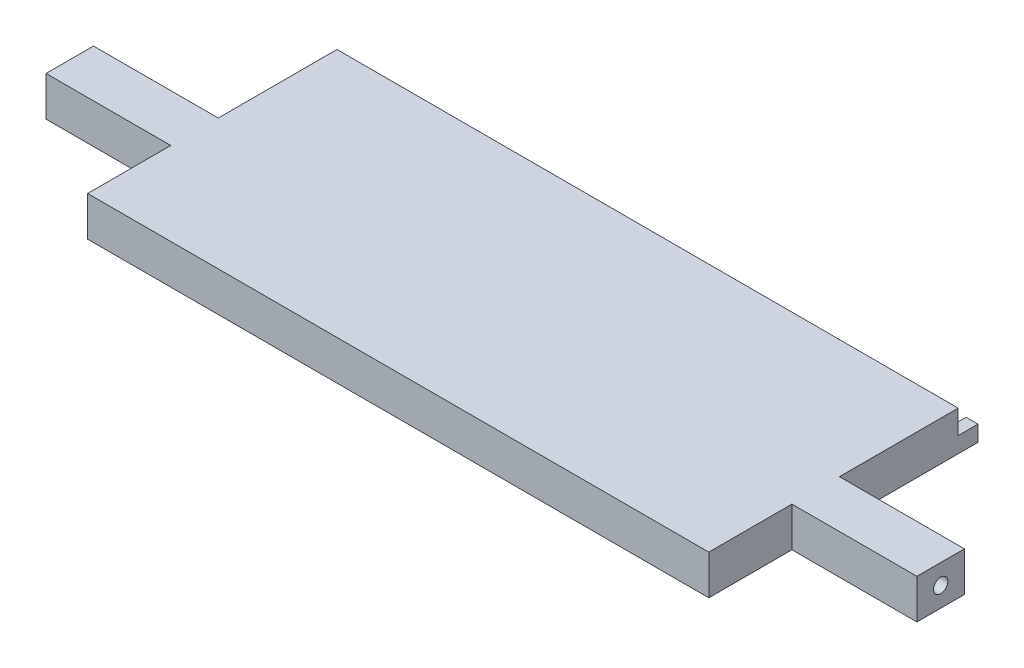
ISO-10303-21;
HEADER;
FILE_DESCRIPTION(('STEP AP214'),'2;1');
FILE_NAME('part.step','',(''),(''),'','','');
FILE_SCHEMA(('AUTOMOTIVE_DESIGN { 1 0 10303 214 1 1 1 1 }'));
ENDSEC;
DATA;
#1=APPLICATION_CONTEXT('core data for automotive mechanical design processes');
#2=APPLICATION_PROTOCOL_DEFINITION('international standard','automotive_design',2000,#1);
#3=PRODUCT_CONTEXT('',#1,'mechanical');
#4=PRODUCT('Part','Part','',(#3));
#5=PRODUCT_RELATED_PRODUCT_CATEGORY('part','',(#4));
#6=PRODUCT_DEFINITION_FORMATION('','',#4);
#7=PRODUCT_DEFINITION_CONTEXT('part definition',#1,'design');
#8=PRODUCT_DEFINITION('design','',#6,#7);
#9=PRODUCT_DEFINITION_SHAPE('','',#8);
#10=(LENGTH_UNIT() NAMED_UNIT(*) SI_UNIT(.MILLI.,.METRE.));
#11=(NAMED_UNIT(*) PLANE_ANGLE_UNIT() SI_UNIT($,.RADIAN.));
#12=(NAMED_UNIT(*) SI_UNIT($,.STERADIAN.) SOLID_ANGLE_UNIT());
#13=UNCERTAINTY_MEASURE_WITH_UNIT(LENGTH_MEASURE(1.E-05),#10,'distance_accuracy_value','');
#14=(GEOMETRIC_REPRESENTATION_CONTEXT(3) GLOBAL_UNCERTAINTY_ASSIGNED_CONTEXT((#13)) GLOBAL_UNIT_ASSIGNED_CONTEXT((#10,
#11,#12)) REPRESENTATION_CONTEXT('',''));
#15=CARTESIAN_POINT('',(0.,0.,0.));
#16=DIRECTION('',(0.,0.,1.));
#17=DIRECTION('',(1.,0.,0.));
#18=AXIS2_PLACEMENT_3D('',#15,#16,#17);
#19=CARTESIAN_POINT('',(0.,0.,0.));
#20=DIRECTION('',(0.,0.,-1.));
#21=DIRECTION('',(-1.,0.,0.));
#22=AXIS2_PLACEMENT_3D('',#19,#20,#21);
#23=PLANE('',#22);
#24=DIRECTION('',(0.,1.,0.));
#25=VECTOR('',#24,1.);
#26=CARTESIAN_POINT('',(188.428323293158,0.,0.));
#27=LINE('',#26,#25);
#28=CARTESIAN_POINT('',(188.428323293158,0.,0.));
#29=VERTEX_POINT('',#28);
#30=CARTESIAN_POINT('',(188.428323293158,4.,0.));
#31=VERTEX_POINT('',#30);
#32=EDGE_CURVE('E318',#29,#31,#27,.T.);
#33=ORIENTED_EDGE('',*,*,#32,.F.);
#34=DIRECTION('',(1.,0.,0.));
#35=VECTOR('',#34,1.);
#36=CARTESIAN_POINT('',(0.,0.,0.));
#37=LINE('',#36,#35);
#38=CARTESIAN_POINT('',(31.5116767068419,0.,0.));
#39=VERTEX_POINT('',#38);
#40=EDGE_CURVE('E476',#39,#29,#37,.T.);
#41=ORIENTED_EDGE('',*,*,#40,.F.);
#42=DIRECTION('',(0.,1.,0.));
#43=VECTOR('',#42,1.);
#44=CARTESIAN_POINT('',(31.5116767068419,0.,0.));
#45=LINE('',#44,#43);
#46=CARTESIAN_POINT('',(31.5116767068419,4.,0.));
#47=VERTEX_POINT('',#46);
#48=EDGE_CURVE('E338',#39,#47,#45,.T.);
#49=ORIENTED_EDGE('',*,*,#48,.T.);
#50=DIRECTION('',(-1.,0.,0.));
#51=VECTOR('',#50,1.);
#52=CARTESIAN_POINT('',(0.,4.,0.));
#53=LINE('',#52,#51);
#54=CARTESIAN_POINT('',(34.5116767068419,4.,0.));
#55=VERTEX_POINT('',#54);
#56=EDGE_CURVE('E351',#55,#47,#53,.T.);
#57=ORIENTED_EDGE('',*,*,#56,.F.);
#58=CARTESIAN_POINT('',(37.97,5.,0.));
#59=DIRECTION('',(0.,0.,1.));
#60=DIRECTION('',(1.,0.,0.));
#61=AXIS2_PLACEMENT_3D('',#58,#59,#60);
#62=CIRCLE('',#61,3.6);
#63=CARTESIAN_POINT('',(41.4283232931581,4.,0.));
#64=VERTEX_POINT('',#63);
#65=EDGE_CURVE('E471',#55,#64,#62,.T.);
#66=ORIENTED_EDGE('',*,*,#65,.T.);
#67=CARTESIAN_POINT('',(52.5116767068419,4.,0.));
#68=VERTEX_POINT('',#67);
#69=EDGE_CURVE('E512',#68,#64,#53,.T.);
#70=ORIENTED_EDGE('',*,*,#69,.F.);
#71=CARTESIAN_POINT('',(55.97,5.,0.));
#72=DIRECTION('',(0.,0.,1.));
#73=DIRECTION('',(1.,0.,0.));
#74=AXIS2_PLACEMENT_3D('',#71,#72,#73);
#75=CIRCLE('',#74,3.6);
#76=CARTESIAN_POINT('',(59.4283232931581,4.,0.));
#77=VERTEX_POINT('',#76);
#78=EDGE_CURVE('E466',#68,#77,#75,.T.);
#79=ORIENTED_EDGE('',*,*,#78,.T.);
#80=CARTESIAN_POINT('',(70.5116767068419,4.,0.));
#81=VERTEX_POINT('',#80);
#82=EDGE_CURVE('E513',#81,#77,#53,.T.);
#83=ORIENTED_EDGE('',*,*,#82,.F.);
#84=CARTESIAN_POINT('',(73.97,5.,0.));
#85=DIRECTION('',(0.,0.,1.));
#86=DIRECTION('',(1.,0.,0.));
#87=AXIS2_PLACEMENT_3D('',#84,#85,#86);
#88=CIRCLE('',#87,3.6);
#89=CARTESIAN_POINT('',(77.4283232931581,4.,0.));
#90=VERTEX_POINT('',#89);
#91=EDGE_CURVE('E460',#81,#90,#88,.T.);
#92=ORIENTED_EDGE('',*,*,#91,.T.);
#93=CARTESIAN_POINT('',(88.5116767068419,4.,0.));
#94=VERTEX_POINT('',#93);
#95=EDGE_CURVE('E516',#94,#90,#53,.T.);
#96=ORIENTED_EDGE('',*,*,#95,.F.);
#97=CARTESIAN_POINT('',(91.97,5.,0.));
#98=DIRECTION('',(0.,0.,1.));
#99=DIRECTION('',(1.,0.,0.));
#100=AXIS2_PLACEMENT_3D('',#97,#98,#99);
#101=CIRCLE('',#100,3.6);
#102=CARTESIAN_POINT('',(95.4283232931581,4.,0.));
#103=VERTEX_POINT('',#102);
#104=EDGE_CURVE('E454',#94,#103,#101,.T.);
#105=ORIENTED_EDGE('',*,*,#104,.T.);
#106=CARTESIAN_POINT('',(106.511676706842,4.,0.));
#107=VERTEX_POINT('',#106);
#108=EDGE_CURVE('E519',#107,#103,#53,.T.);
#109=ORIENTED_EDGE('',*,*,#108,.F.);
#110=CARTESIAN_POINT('',(109.97,5.,0.));
#111=DIRECTION('',(0.,0.,1.));
#112=DIRECTION('',(1.,0.,0.));
#113=AXIS2_PLACEMENT_3D('',#110,#111,#112);
#114=CIRCLE('',#113,3.6);
#115=CARTESIAN_POINT('',(113.428323293158,4.,0.));
#116=VERTEX_POINT('',#115);
#117=EDGE_CURVE('E448',#107,#116,#114,.T.);
#118=ORIENTED_EDGE('',*,*,#117,.T.);
#119=CARTESIAN_POINT('',(124.511676706842,4.,0.));
#120=VERTEX_POINT('',#119);
#121=EDGE_CURVE('E522',#120,#116,#53,.T.);
#122=ORIENTED_EDGE('',*,*,#121,.F.);
#123=CARTESIAN_POINT('',(127.97,5.,0.));
#124=DIRECTION('',(0.,0.,1.));
#125=DIRECTION('',(1.,0.,0.));
#126=AXIS2_PLACEMENT_3D('',#123,#124,#125);
#127=CIRCLE('',#126,3.59999999999999);
#128=CARTESIAN_POINT('',(131.428323293158,4.,0.));
#129=VERTEX_POINT('',#128);
#130=EDGE_CURVE('E442',#120,#129,#127,.T.);
#131=ORIENTED_EDGE('',*,*,#130,.T.);
#132=CARTESIAN_POINT('',(142.511676706842,4.,0.));
#133=VERTEX_POINT('',#132);
#134=EDGE_CURVE('E525',#133,#129,#53,.T.);
#135=ORIENTED_EDGE('',*,*,#134,.F.);
#136=CARTESIAN_POINT('',(145.97,5.,0.));
#137=DIRECTION('',(0.,0.,1.));
#138=DIRECTION('',(1.,0.,0.));
#139=AXIS2_PLACEMENT_3D('',#136,#137,#138);
#140=CIRCLE('',#139,3.59999999999999);
#141=CARTESIAN_POINT('',(149.428323293158,4.,0.));
#142=VERTEX_POINT('',#141);
#143=EDGE_CURVE('E436',#133,#142,#140,.T.);
#144=ORIENTED_EDGE('',*,*,#143,.T.);
#145=CARTESIAN_POINT('',(160.511676706842,4.,0.));
#146=VERTEX_POINT('',#145);
#147=EDGE_CURVE('E528',#146,#142,#53,.T.);
#148=ORIENTED_EDGE('',*,*,#147,.F.);
#149=CARTESIAN_POINT('',(163.97,5.,0.));
#150=DIRECTION('',(0.,0.,1.));
#151=DIRECTION('',(1.,0.,0.));
#152=AXIS2_PLACEMENT_3D('',#149,#150,#151);
#153=CIRCLE('',#152,3.59999999999999);
#154=CARTESIAN_POINT('',(167.428323293158,4.,0.));
#155=VERTEX_POINT('',#154);
#156=EDGE_CURVE('E430',#146,#155,#153,.T.);
#157=ORIENTED_EDGE('',*,*,#156,.T.);
#158=CARTESIAN_POINT('',(178.511676706842,4.,0.));
#159=VERTEX_POINT('',#158);
#160=EDGE_CURVE('E357',#159,#155,#53,.T.);
#161=ORIENTED_EDGE('',*,*,#160,.F.);
#162=CARTESIAN_POINT('',(181.97,5.,0.));
#163=DIRECTION('',(0.,0.,1.));
#164=DIRECTION('',(1.,0.,0.));
#165=AXIS2_PLACEMENT_3D('',#162,#163,#164);
#166=CIRCLE('',#165,3.59999999999999);
#167=CARTESIAN_POINT('',(185.428323293158,4.,0.));
#168=VERTEX_POINT('',#167);
#169=EDGE_CURVE('E424',#159,#168,#166,.T.);
#170=ORIENTED_EDGE('',*,*,#169,.T.);
#171=EDGE_CURVE('E354',#31,#168,#53,.T.);
#172=ORIENTED_EDGE('',*,*,#171,.F.);
#173=EDGE_LOOP('',(#33,#41,#49,#57,#66,#70,#79,#83,#92,#96,#105,#109,#118,#122,#131,#135,#144,
#148,#157,#161,#170,#172));
#174=FACE_BOUND('',#173,.T.);
#175=ADVANCED_FACE('F35',(#174),#23,.T.);
#176=CARTESIAN_POINT('',(37.97,5.,65.));
#177=DIRECTION('',(0.,0.,-1.));
#178=DIRECTION('',(-1.,0.,0.));
#179=AXIS2_PLACEMENT_3D('',#176,#177,#178);
#180=CYLINDRICAL_SURFACE('',#179,3.6);
#181=CARTESIAN_POINT('',(37.97,5.,65.));
#182=DIRECTION('',(0.,0.,1.));
#183=DIRECTION('',(1.,0.,0.));
#184=AXIS2_PLACEMENT_3D('',#181,#182,#183);
#185=CIRCLE('',#184,3.6);
#186=CARTESIAN_POINT('',(41.57,5.,65.));
#187=VERTEX_POINT('',#186);
#188=EDGE_CURVE('E284',#187,#187,#185,.T.);
#189=ORIENTED_EDGE('',*,*,#188,.T.);
#190=EDGE_LOOP('',(#189));
#191=FACE_BOUND('',#190,.T.);
#192=CARTESIAN_POINT('',(37.97,5.,5.));
#193=DIRECTION('',(0.,0.,1.));
#194=DIRECTION('',(1.,0.,0.));
#195=AXIS2_PLACEMENT_3D('',#192,#193,#194);
#196=CIRCLE('',#195,3.6);
#197=CARTESIAN_POINT('',(41.4283232931581,4.,5.));
#198=VERTEX_POINT('',#197);
#199=CARTESIAN_POINT('',(34.5116767068419,4.,5.));
#200=VERTEX_POINT('',#199);
#201=EDGE_CURVE('E421',#198,#200,#196,.T.);
#202=ORIENTED_EDGE('',*,*,#201,.F.);
#203=DIRECTION('',(0.,0.,-1.));
#204=VECTOR('',#203,1.);
#205=CARTESIAN_POINT('',(41.4283232931581,4.,65.));
#206=LINE('',#205,#204);
#207=EDGE_CURVE('E404',#198,#64,#206,.T.);
#208=ORIENTED_EDGE('',*,*,#207,.T.);
#209=ORIENTED_EDGE('',*,*,#65,.F.);
#210=DIRECTION('',(0.,0.,-1.));
#211=VECTOR('',#210,1.);
#212=CARTESIAN_POINT('',(34.5116767068419,4.,65.));
#213=LINE('',#212,#211);
#214=EDGE_CURVE('E401',#55,#200,#213,.F.);
#215=ORIENTED_EDGE('',*,*,#214,.T.);
#216=EDGE_LOOP('',(#202,#208,#209,#215));
#217=FACE_BOUND('',#216,.T.);
#218=ADVANCED_FACE('F580',(#191,#217),#180,.F.);
#219=CARTESIAN_POINT('',(55.97,5.,65.));
#220=DIRECTION('',(0.,0.,-1.));
#221=DIRECTION('',(-1.,0.,0.));
#222=AXIS2_PLACEMENT_3D('',#219,#220,#221);
#223=CYLINDRICAL_SURFACE('',#222,3.6);
#224=CARTESIAN_POINT('',(55.97,5.,65.));
#225=DIRECTION('',(0.,0.,1.));
#226=DIRECTION('',(1.,0.,0.));
#227=AXIS2_PLACEMENT_3D('',#224,#225,#226);
#228=CIRCLE('',#227,3.6);
#229=CARTESIAN_POINT('',(59.57,5.,65.));
#230=VERTEX_POINT('',#229);
#231=EDGE_CURVE('E463',#230,#230,#228,.T.);
#232=ORIENTED_EDGE('',*,*,#231,.T.);
#233=EDGE_LOOP('',(#232));
#234=FACE_BOUND('',#233,.T.);
#235=CARTESIAN_POINT('',(55.97,5.,5.));
#236=DIRECTION('',(0.,0.,1.));
#237=DIRECTION('',(1.,0.,0.));
#238=AXIS2_PLACEMENT_3D('',#235,#236,#237);
#239=CIRCLE('',#238,3.6);
#240=CARTESIAN_POINT('',(59.4283232931581,4.,5.));
#241=VERTEX_POINT('',#240);
#242=CARTESIAN_POINT('',(52.5116767068419,4.,5.));
#243=VERTEX_POINT('',#242);
#244=EDGE_CURVE('E419',#241,#243,#239,.T.);
#245=ORIENTED_EDGE('',*,*,#244,.F.);
#246=DIRECTION('',(0.,0.,-1.));
#247=VECTOR('',#246,1.);
#248=CARTESIAN_POINT('',(59.4283232931581,4.,65.));
#249=LINE('',#248,#247);
#250=EDGE_CURVE('E398',#241,#77,#249,.T.);
#251=ORIENTED_EDGE('',*,*,#250,.T.);
#252=ORIENTED_EDGE('',*,*,#78,.F.);
#253=DIRECTION('',(0.,0.,-1.));
#254=VECTOR('',#253,1.);
#255=CARTESIAN_POINT('',(52.5116767068419,4.,65.));
#256=LINE('',#255,#254);
#257=EDGE_CURVE('E395',#68,#243,#256,.F.);
#258=ORIENTED_EDGE('',*,*,#257,.T.);
#259=EDGE_LOOP('',(#245,#251,#252,#258));
#260=FACE_BOUND('',#259,.T.);
#261=ADVANCED_FACE('F584',(#234,#260),#223,.F.);
#262=CARTESIAN_POINT('',(73.97,5.,65.));
#263=DIRECTION('',(0.,0.,-1.));
#264=DIRECTION('',(-1.,0.,0.));
#265=AXIS2_PLACEMENT_3D('',#262,#263,#264);
#266=CYLINDRICAL_SURFACE('',#265,3.6);
#267=CARTESIAN_POINT('',(73.97,5.,65.));
#268=DIRECTION('',(0.,0.,1.));
#269=DIRECTION('',(1.,0.,0.));
#270=AXIS2_PLACEMENT_3D('',#267,#268,#269);
#271=CIRCLE('',#270,3.6);
#272=CARTESIAN_POINT('',(77.57,5.,65.));
#273=VERTEX_POINT('',#272);
#274=EDGE_CURVE('E457',#273,#273,#271,.T.);
#275=ORIENTED_EDGE('',*,*,#274,.T.);
#276=EDGE_LOOP('',(#275));
#277=FACE_BOUND('',#276,.T.);
#278=CARTESIAN_POINT('',(73.97,5.,5.));
#279=DIRECTION('',(0.,0.,1.));
#280=DIRECTION('',(1.,0.,0.));
#281=AXIS2_PLACEMENT_3D('',#278,#279,#280);
#282=CIRCLE('',#281,3.6);
#283=CARTESIAN_POINT('',(77.4283232931581,4.,5.));
#284=VERTEX_POINT('',#283);
#285=CARTESIAN_POINT('',(70.5116767068419,4.,5.));
#286=VERTEX_POINT('',#285);
#287=EDGE_CURVE('E417',#284,#286,#282,.T.);
#288=ORIENTED_EDGE('',*,*,#287,.F.);
#289=DIRECTION('',(0.,0.,-1.));
#290=VECTOR('',#289,1.);
#291=CARTESIAN_POINT('',(77.4283232931581,4.,65.));
#292=LINE('',#291,#290);
#293=EDGE_CURVE('E392',#284,#90,#292,.T.);
#294=ORIENTED_EDGE('',*,*,#293,.T.);
#295=ORIENTED_EDGE('',*,*,#91,.F.);
#296=DIRECTION('',(0.,0.,-1.));
#297=VECTOR('',#296,1.);
#298=CARTESIAN_POINT('',(70.5116767068419,4.,65.));
#299=LINE('',#298,#297);
#300=EDGE_CURVE('E389',#81,#286,#299,.F.);
#301=ORIENTED_EDGE('',*,*,#300,.T.);
#302=EDGE_LOOP('',(#288,#294,#295,#301));
#303=FACE_BOUND('',#302,.T.);
#304=ADVANCED_FACE('F614',(#277,#303),#266,.F.);
#305=CARTESIAN_POINT('',(91.97,5.,65.));
#306=DIRECTION('',(0.,0.,-1.));
#307=DIRECTION('',(-1.,0.,0.));
#308=AXIS2_PLACEMENT_3D('',#305,#306,#307);
#309=CYLINDRICAL_SURFACE('',#308,3.6);
#310=CARTESIAN_POINT('',(91.97,5.,65.));
#311=DIRECTION('',(0.,0.,1.));
#312=DIRECTION('',(1.,0.,0.));
#313=AXIS2_PLACEMENT_3D('',#310,#311,#312);
#314=CIRCLE('',#313,3.6);
#315=CARTESIAN_POINT('',(95.57,5.,65.));
#316=VERTEX_POINT('',#315);
#317=EDGE_CURVE('E451',#316,#316,#314,.T.);
#318=ORIENTED_EDGE('',*,*,#317,.T.);
#319=EDGE_LOOP('',(#318));
#320=FACE_BOUND('',#319,.T.);
#321=CARTESIAN_POINT('',(91.97,5.,5.));
#322=DIRECTION('',(0.,0.,1.));
#323=DIRECTION('',(1.,0.,0.));
#324=AXIS2_PLACEMENT_3D('',#321,#322,#323);
#325=CIRCLE('',#324,3.6);
#326=CARTESIAN_POINT('',(95.4283232931581,4.,5.));
#327=VERTEX_POINT('',#326);
#328=CARTESIAN_POINT('',(88.5116767068419,4.,5.));
#329=VERTEX_POINT('',#328);
#330=EDGE_CURVE('E415',#327,#329,#325,.T.);
#331=ORIENTED_EDGE('',*,*,#330,.F.);
#332=DIRECTION('',(0.,0.,-1.));
#333=VECTOR('',#332,1.);
#334=CARTESIAN_POINT('',(95.4283232931581,4.,65.));
#335=LINE('',#334,#333);
#336=EDGE_CURVE('E386',#327,#103,#335,.T.);
#337=ORIENTED_EDGE('',*,*,#336,.T.);
#338=ORIENTED_EDGE('',*,*,#104,.F.);
#339=DIRECTION('',(0.,0.,-1.));
#340=VECTOR('',#339,1.);
#341=CARTESIAN_POINT('',(88.5116767068419,4.,65.));
#342=LINE('',#341,#340);
#343=EDGE_CURVE('E383',#94,#329,#342,.F.);
#344=ORIENTED_EDGE('',*,*,#343,.T.);
#345=EDGE_LOOP('',(#331,#337,#338,#344));
#346=FACE_BOUND('',#345,.T.);
#347=ADVANCED_FACE('F609',(#320,#346),#309,.F.);
#348=CARTESIAN_POINT('',(109.97,5.,65.));
#349=DIRECTION('',(0.,0.,-1.));
#350=DIRECTION('',(-1.,0.,0.));
#351=AXIS2_PLACEMENT_3D('',#348,#349,#350);
#352=CYLINDRICAL_SURFACE('',#351,3.6);
#353=CARTESIAN_POINT('',(109.97,5.,65.));
#354=DIRECTION('',(0.,0.,1.));
#355=DIRECTION('',(1.,0.,0.));
#356=AXIS2_PLACEMENT_3D('',#353,#354,#355);
#357=CIRCLE('',#356,3.6);
#358=CARTESIAN_POINT('',(113.57,5.,65.));
#359=VERTEX_POINT('',#358);
#360=EDGE_CURVE('E445',#359,#359,#357,.T.);
#361=ORIENTED_EDGE('',*,*,#360,.T.);
#362=EDGE_LOOP('',(#361));
#363=FACE_BOUND('',#362,.T.);
#364=CARTESIAN_POINT('',(109.97,5.,5.));
#365=DIRECTION('',(0.,0.,1.));
#366=DIRECTION('',(1.,0.,0.));
#367=AXIS2_PLACEMENT_3D('',#364,#365,#366);
#368=CIRCLE('',#367,3.6);
#369=CARTESIAN_POINT('',(113.428323293158,4.,5.));
#370=VERTEX_POINT('',#369);
#371=CARTESIAN_POINT('',(106.511676706842,4.,5.));
#372=VERTEX_POINT('',#371);
#373=EDGE_CURVE('E413',#370,#372,#368,.T.);
#374=ORIENTED_EDGE('',*,*,#373,.F.);
#375=DIRECTION('',(0.,0.,-1.));
#376=VECTOR('',#375,1.);
#377=CARTESIAN_POINT('',(113.428323293158,4.,65.));
#378=LINE('',#377,#376);
#379=EDGE_CURVE('E380',#370,#116,#378,.T.);
#380=ORIENTED_EDGE('',*,*,#379,.T.);
#381=ORIENTED_EDGE('',*,*,#117,.F.);
#382=DIRECTION('',(0.,0.,-1.));
#383=VECTOR('',#382,1.);
#384=CARTESIAN_POINT('',(106.511676706842,4.,65.));
#385=LINE('',#384,#383);
#386=EDGE_CURVE('E377',#107,#372,#385,.F.);
#387=ORIENTED_EDGE('',*,*,#386,.T.);
#388=EDGE_LOOP('',(#374,#380,#381,#387));
#389=FACE_BOUND('',#388,.T.);
#390=ADVANCED_FACE('F606',(#363,#389),#352,.F.);
#391=CARTESIAN_POINT('',(127.97,5.,65.));
#392=DIRECTION('',(0.,0.,-1.));
#393=DIRECTION('',(-1.,0.,0.));
#394=AXIS2_PLACEMENT_3D('',#391,#392,#393);
#395=CYLINDRICAL_SURFACE('',#394,3.59999999999999);
#396=CARTESIAN_POINT('',(127.97,5.,65.));
#397=DIRECTION('',(0.,0.,1.));
#398=DIRECTION('',(1.,0.,0.));
#399=AXIS2_PLACEMENT_3D('',#396,#397,#398);
#400=CIRCLE('',#399,3.59999999999999);
#401=CARTESIAN_POINT('',(131.57,5.,65.));
#402=VERTEX_POINT('',#401);
#403=EDGE_CURVE('E439',#402,#402,#400,.T.);
#404=ORIENTED_EDGE('',*,*,#403,.T.);
#405=EDGE_LOOP('',(#404));
#406=FACE_BOUND('',#405,.T.);
#407=CARTESIAN_POINT('',(127.97,5.,5.));
#408=DIRECTION('',(0.,0.,1.));
#409=DIRECTION('',(1.,0.,0.));
#410=AXIS2_PLACEMENT_3D('',#407,#408,#409);
#411=CIRCLE('',#410,3.59999999999999);
#412=CARTESIAN_POINT('',(131.428323293158,4.,5.));
#413=VERTEX_POINT('',#412);
#414=CARTESIAN_POINT('',(124.511676706842,4.,5.));
#415=VERTEX_POINT('',#414);
#416=EDGE_CURVE('E411',#413,#415,#411,.T.);
#417=ORIENTED_EDGE('',*,*,#416,.F.);
#418=DIRECTION('',(0.,0.,-1.));
#419=VECTOR('',#418,1.);
#420=CARTESIAN_POINT('',(131.428323293158,4.,65.));
#421=LINE('',#420,#419);
#422=EDGE_CURVE('E374',#413,#129,#421,.T.);
#423=ORIENTED_EDGE('',*,*,#422,.T.);
#424=ORIENTED_EDGE('',*,*,#130,.F.);
#425=DIRECTION('',(0.,0.,-1.));
#426=VECTOR('',#425,1.);
#427=CARTESIAN_POINT('',(124.511676706842,4.,65.));
#428=LINE('',#427,#426);
#429=EDGE_CURVE('E371',#120,#415,#428,.F.);
#430=ORIENTED_EDGE('',*,*,#429,.T.);
#431=EDGE_LOOP('',(#417,#423,#424,#430));
#432=FACE_BOUND('',#431,.T.);
#433=ADVANCED_FACE('F603',(#406,#432),#395,.F.);
#434=CARTESIAN_POINT('',(145.97,5.,65.));
#435=DIRECTION('',(0.,0.,-1.));
#436=DIRECTION('',(-1.,0.,0.));
#437=AXIS2_PLACEMENT_3D('',#434,#435,#436);
#438=CYLINDRICAL_SURFACE('',#437,3.59999999999999);
#439=CARTESIAN_POINT('',(145.97,5.,65.));
#440=DIRECTION('',(0.,0.,1.));
#441=DIRECTION('',(1.,0.,0.));
#442=AXIS2_PLACEMENT_3D('',#439,#440,#441);
#443=CIRCLE('',#442,3.59999999999999);
#444=CARTESIAN_POINT('',(149.57,5.,65.));
#445=VERTEX_POINT('',#444);
#446=EDGE_CURVE('E433',#445,#445,#443,.T.);
#447=ORIENTED_EDGE('',*,*,#446,.T.);
#448=EDGE_LOOP('',(#447));
#449=FACE_BOUND('',#448,.T.);
#450=CARTESIAN_POINT('',(145.97,5.,5.));
#451=DIRECTION('',(0.,0.,1.));
#452=DIRECTION('',(1.,0.,0.));
#453=AXIS2_PLACEMENT_3D('',#450,#451,#452);
#454=CIRCLE('',#453,3.59999999999999);
#455=CARTESIAN_POINT('',(149.428323293158,4.,5.));
#456=VERTEX_POINT('',#455);
#457=CARTESIAN_POINT('',(142.511676706842,4.,5.));
#458=VERTEX_POINT('',#457);
#459=EDGE_CURVE('E409',#456,#458,#454,.T.);
#460=ORIENTED_EDGE('',*,*,#459,.F.);
#461=DIRECTION('',(0.,0.,-1.));
#462=VECTOR('',#461,1.);
#463=CARTESIAN_POINT('',(149.428323293158,4.,65.));
#464=LINE('',#463,#462);
#465=EDGE_CURVE('E368',#456,#142,#464,.T.);
#466=ORIENTED_EDGE('',*,*,#465,.T.);
#467=ORIENTED_EDGE('',*,*,#143,.F.);
#468=DIRECTION('',(0.,0.,-1.));
#469=VECTOR('',#468,1.);
#470=CARTESIAN_POINT('',(142.511676706842,4.,65.));
#471=LINE('',#470,#469);
#472=EDGE_CURVE('E365',#133,#458,#471,.F.);
#473=ORIENTED_EDGE('',*,*,#472,.T.);
#474=EDGE_LOOP('',(#460,#466,#467,#473));
#475=FACE_BOUND('',#474,.T.);
#476=ADVANCED_FACE('F545',(#449,#475),#438,.F.);
#477=CARTESIAN_POINT('',(163.97,5.,65.));
#478=DIRECTION('',(0.,0.,-1.));
#479=DIRECTION('',(-1.,0.,0.));
#480=AXIS2_PLACEMENT_3D('',#477,#478,#479);
#481=CYLINDRICAL_SURFACE('',#480,3.59999999999999);
#482=CARTESIAN_POINT('',(163.97,5.,65.));
#483=DIRECTION('',(0.,0.,1.));
#484=DIRECTION('',(1.,0.,0.));
#485=AXIS2_PLACEMENT_3D('',#482,#483,#484);
#486=CIRCLE('',#485,3.59999999999999);
#487=CARTESIAN_POINT('',(167.57,5.,65.));
#488=VERTEX_POINT('',#487);
#489=EDGE_CURVE('E427',#488,#488,#486,.T.);
#490=ORIENTED_EDGE('',*,*,#489,.T.);
#491=EDGE_LOOP('',(#490));
#492=FACE_BOUND('',#491,.T.);
#493=CARTESIAN_POINT('',(163.97,5.,5.));
#494=DIRECTION('',(0.,0.,1.));
#495=DIRECTION('',(1.,0.,0.));
#496=AXIS2_PLACEMENT_3D('',#493,#494,#495);
#497=CIRCLE('',#496,3.59999999999999);
#498=CARTESIAN_POINT('',(167.428323293158,4.,5.));
#499=VERTEX_POINT('',#498);
#500=CARTESIAN_POINT('',(160.511676706842,4.,5.));
#501=VERTEX_POINT('',#500);
#502=EDGE_CURVE('E407',#499,#501,#497,.T.);
#503=ORIENTED_EDGE('',*,*,#502,.F.);
#504=DIRECTION('',(0.,0.,-1.));
#505=VECTOR('',#504,1.);
#506=CARTESIAN_POINT('',(167.428323293158,4.,65.));
#507=LINE('',#506,#505);
#508=EDGE_CURVE('E362',#499,#155,#507,.T.);
#509=ORIENTED_EDGE('',*,*,#508,.T.);
#510=ORIENTED_EDGE('',*,*,#156,.F.);
#511=DIRECTION('',(0.,0.,-1.));
#512=VECTOR('',#511,1.);
#513=CARTESIAN_POINT('',(160.511676706842,4.,65.));
#514=LINE('',#513,#512);
#515=EDGE_CURVE('E356',#146,#501,#514,.F.);
#516=ORIENTED_EDGE('',*,*,#515,.T.);
#517=EDGE_LOOP('',(#503,#509,#510,#516));
#518=FACE_BOUND('',#517,.T.);
#519=ADVANCED_FACE('F541',(#492,#518),#481,.F.);
#520=CARTESIAN_POINT('',(181.97,5.,65.));
#521=DIRECTION('',(0.,0.,-1.));
#522=DIRECTION('',(-1.,0.,0.));
#523=AXIS2_PLACEMENT_3D('',#520,#521,#522);
#524=CYLINDRICAL_SURFACE('',#523,3.59999999999999);
#525=CARTESIAN_POINT('',(181.97,5.,65.));
#526=DIRECTION('',(0.,0.,1.));
#527=DIRECTION('',(1.,0.,0.));
#528=AXIS2_PLACEMENT_3D('',#525,#526,#527);
#529=CIRCLE('',#528,3.59999999999999);
#530=CARTESIAN_POINT('',(185.57,5.,65.));
#531=VERTEX_POINT('',#530);
#532=EDGE_CURVE('E276',#531,#531,#529,.T.);
#533=ORIENTED_EDGE('',*,*,#532,.T.);
#534=EDGE_LOOP('',(#533));
#535=FACE_BOUND('',#534,.T.);
#536=CARTESIAN_POINT('',(181.97,5.,5.));
#537=DIRECTION('',(0.,0.,1.));
#538=DIRECTION('',(1.,0.,0.));
#539=AXIS2_PLACEMENT_3D('',#536,#537,#538);
#540=CIRCLE('',#539,3.59999999999999);
#541=CARTESIAN_POINT('',(185.428323293158,4.,5.));
#542=VERTEX_POINT('',#541);
#543=CARTESIAN_POINT('',(178.511676706842,4.,5.));
#544=VERTEX_POINT('',#543);
#545=EDGE_CURVE('E494',#542,#544,#540,.T.);
#546=ORIENTED_EDGE('',*,*,#545,.F.);
#547=DIRECTION('',(0.,0.,-1.));
#548=VECTOR('',#547,1.);
#549=CARTESIAN_POINT('',(185.428323293158,4.,65.));
#550=LINE('',#549,#548);
#551=EDGE_CURVE('E497',#542,#168,#550,.T.);
#552=ORIENTED_EDGE('',*,*,#551,.T.);
#553=ORIENTED_EDGE('',*,*,#169,.F.);
#554=DIRECTION('',(0.,0.,-1.));
#555=VECTOR('',#554,1.);
#556=CARTESIAN_POINT('',(178.511676706842,4.,65.));
#557=LINE('',#556,#555);
#558=EDGE_CURVE('E491',#159,#544,#557,.F.);
#559=ORIENTED_EDGE('',*,*,#558,.T.);
#560=EDGE_LOOP('',(#546,#552,#553,#559));
#561=FACE_BOUND('',#560,.T.);
#562=ADVANCED_FACE('F564',(#535,#561),#524,.F.);
#563=CARTESIAN_POINT('',(0.,0.,65.));
#564=DIRECTION('',(1.,0.,0.));
#565=DIRECTION('',(0.,0.,-1.));
#566=AXIS2_PLACEMENT_3D('',#563,#564,#565);
#567=PLANE('',#566);
#568=CARTESIAN_POINT('',(0.,5.,41.));
#569=DIRECTION('',(-1.,0.,0.));
#570=DIRECTION('',(0.,0.,1.));
#571=AXIS2_PLACEMENT_3D('',#568,#569,#570);
#572=CIRCLE('',#571,1.8);
#573=CARTESIAN_POINT('',(0.,5.,42.8));
#574=VERTEX_POINT('',#573);
#575=EDGE_CURVE('E280',#574,#574,#572,.T.);
#576=ORIENTED_EDGE('',*,*,#575,.F.);
#577=EDGE_LOOP('',(#576));
#578=FACE_BOUND('',#577,.T.);
#579=DIRECTION('',(0.,0.,-1.));
#580=VECTOR('',#579,1.);
#581=CARTESIAN_POINT('',(0.,0.,65.));
#582=LINE('',#581,#580);
#583=CARTESIAN_POINT('',(0.,0.,47.));
#584=VERTEX_POINT('',#583);
#585=CARTESIAN_POINT('',(0.,0.,35.));
#586=VERTEX_POINT('',#585);
#587=EDGE_CURVE('E488',#584,#586,#582,.T.);
#588=ORIENTED_EDGE('',*,*,#587,.F.);
#589=DIRECTION('',(0.,1.,0.));
#590=VECTOR('',#589,1.);
#591=CARTESIAN_POINT('',(0.,0.,47.));
#592=LINE('',#591,#590);
#593=CARTESIAN_POINT('',(0.,10.,47.));
#594=VERTEX_POINT('',#593);
#595=EDGE_CURVE('E306',#584,#594,#592,.T.);
#596=ORIENTED_EDGE('',*,*,#595,.T.);
#597=DIRECTION('',(0.,0.,-1.));
#598=VECTOR('',#597,1.);
#599=CARTESIAN_POINT('',(0.,10.,65.));
#600=LINE('',#599,#598);
#601=CARTESIAN_POINT('',(0.,10.,35.));
#602=VERTEX_POINT('',#601);
#603=EDGE_CURVE('E479',#594,#602,#600,.T.);
#604=ORIENTED_EDGE('',*,*,#603,.T.);
#605=DIRECTION('',(0.,1.,0.));
#606=VECTOR('',#605,1.);
#607=CARTESIAN_POINT('',(0.,0.,35.));
#608=LINE('',#607,#606);
#609=EDGE_CURVE('E334',#586,#602,#608,.T.);
#610=ORIENTED_EDGE('',*,*,#609,.F.);
#611=EDGE_LOOP('',(#588,#596,#604,#610));
#612=FACE_BOUND('',#611,.T.);
#613=ADVANCED_FACE('F37',(#578,#612),#567,.F.);
#614=CARTESIAN_POINT('',(0.,0.,65.));
#615=DIRECTION('',(0.,1.,0.));
#616=DIRECTION('',(0.,0.,1.));
#617=AXIS2_PLACEMENT_3D('',#614,#615,#616);
#618=PLANE('',#617);
#619=DIRECTION('',(0.,0.,-1.));
#620=VECTOR('',#619,1.);
#621=CARTESIAN_POINT('',(31.5116767068419,0.,65.));
#622=LINE('',#621,#620);
#623=CARTESIAN_POINT('',(31.5116767068419,0.,68.));
#624=VERTEX_POINT('',#623);
#625=CARTESIAN_POINT('',(31.5116767068419,0.,47.));
#626=VERTEX_POINT('',#625);
#627=EDGE_CURVE('E244',#624,#626,#622,.T.);
#628=ORIENTED_EDGE('',*,*,#627,.T.);
#629=DIRECTION('',(-1.,0.,0.));
#630=VECTOR('',#629,1.);
#631=CARTESIAN_POINT('',(0.,0.,47.));
#632=LINE('',#631,#630);
#633=EDGE_CURVE('E254',#626,#584,#632,.T.);
#634=ORIENTED_EDGE('',*,*,#633,.T.);
#635=ORIENTED_EDGE('',*,*,#587,.T.);
#636=DIRECTION('',(1.,0.,0.));
#637=VECTOR('',#636,1.);
#638=CARTESIAN_POINT('',(0.,0.,35.));
#639=LINE('',#638,#637);
#640=CARTESIAN_POINT('',(31.5116767068419,0.,35.));
#641=VERTEX_POINT('',#640);
#642=EDGE_CURVE('E327',#586,#641,#639,.T.);
#643=ORIENTED_EDGE('',*,*,#642,.T.);
#644=DIRECTION('',(0.,0.,-1.));
#645=VECTOR('',#644,1.);
#646=CARTESIAN_POINT('',(31.5116767068419,0.,0.));
#647=LINE('',#646,#645);
#648=EDGE_CURVE('E330',#641,#39,#647,.T.);
#649=ORIENTED_EDGE('',*,*,#648,.T.);
#650=ORIENTED_EDGE('',*,*,#40,.T.);
#651=DIRECTION('',(0.,0.,1.));
#652=VECTOR('',#651,1.);
#653=CARTESIAN_POINT('',(188.428323293158,0.,0.));
#654=LINE('',#653,#652);
#655=CARTESIAN_POINT('',(188.428323293158,0.,35.));
#656=VERTEX_POINT('',#655);
#657=EDGE_CURVE('E311',#29,#656,#654,.T.);
#658=ORIENTED_EDGE('',*,*,#657,.T.);
#659=DIRECTION('',(1.,0.,0.));
#660=VECTOR('',#659,1.);
#661=CARTESIAN_POINT('',(220.,0.,35.));
#662=LINE('',#661,#660);
#663=CARTESIAN_POINT('',(220.,0.,35.));
#664=VERTEX_POINT('',#663);
#665=EDGE_CURVE('E314',#656,#664,#662,.T.);
#666=ORIENTED_EDGE('',*,*,#665,.T.);
#667=DIRECTION('',(0.,0.,-1.));
#668=VECTOR('',#667,1.);
#669=CARTESIAN_POINT('',(220.,0.,65.));
#670=LINE('',#669,#668);
#671=CARTESIAN_POINT('',(220.,0.,47.));
#672=VERTEX_POINT('',#671);
#673=EDGE_CURVE('E485',#672,#664,#670,.T.);
#674=ORIENTED_EDGE('',*,*,#673,.F.);
#675=DIRECTION('',(-1.,0.,0.));
#676=VECTOR('',#675,1.);
#677=CARTESIAN_POINT('',(220.,0.,47.));
#678=LINE('',#677,#676);
#679=CARTESIAN_POINT('',(188.428323293158,0.,47.));
#680=VERTEX_POINT('',#679);
#681=EDGE_CURVE('E291',#672,#680,#678,.T.);
#682=ORIENTED_EDGE('',*,*,#681,.T.);
#683=DIRECTION('',(0.,0.,1.));
#684=VECTOR('',#683,1.);
#685=CARTESIAN_POINT('',(188.428323293158,0.,65.));
#686=LINE('',#685,#684);
#687=CARTESIAN_POINT('',(188.428323293158,0.,68.));
#688=VERTEX_POINT('',#687);
#689=EDGE_CURVE('E262',#680,#688,#686,.T.);
#690=ORIENTED_EDGE('',*,*,#689,.T.);
#691=DIRECTION('',(1.,0.,0.));
#692=VECTOR('',#691,1.);
#693=CARTESIAN_POINT('',(31.5116767068419,0.,68.));
#694=LINE('',#693,#692);
#695=EDGE_CURVE('E258',#624,#688,#694,.T.);
#696=ORIENTED_EDGE('',*,*,#695,.F.);
#697=EDGE_LOOP('',(#628,#634,#635,#643,#649,#650,#658,#666,#674,#682,#690,#696));
#698=FACE_BOUND('',#697,.T.);
#699=ADVANCED_FACE('F259',(#698),#618,.F.);
#700=CARTESIAN_POINT('',(220.,0.,65.));
#701=DIRECTION('',(-1.,0.,0.));
#702=DIRECTION('',(0.,0.,1.));
#703=AXIS2_PLACEMENT_3D('',#700,#701,#702);
#704=PLANE('',#703);
#705=CARTESIAN_POINT('',(220.,5.,41.));
#706=DIRECTION('',(1.,0.,0.));
#707=DIRECTION('',(0.,0.,-1.));
#708=AXIS2_PLACEMENT_3D('',#705,#706,#707);
#709=CIRCLE('',#708,1.8);
#710=CARTESIAN_POINT('',(220.,5.,39.2));
#711=VERTEX_POINT('',#710);
#712=EDGE_CURVE('E281',#711,#711,#709,.T.);
#713=ORIENTED_EDGE('',*,*,#712,.F.);
#714=EDGE_LOOP('',(#713));
#715=FACE_BOUND('',#714,.T.);
#716=ORIENTED_EDGE('',*,*,#673,.T.);
#717=DIRECTION('',(0.,1.,0.));
#718=VECTOR('',#717,1.);
#719=CARTESIAN_POINT('',(220.,0.,35.));
#720=LINE('',#719,#718);
#721=CARTESIAN_POINT('',(220.,10.,35.));
#722=VERTEX_POINT('',#721);
#723=EDGE_CURVE('E304',#664,#722,#720,.T.);
#724=ORIENTED_EDGE('',*,*,#723,.T.);
#725=DIRECTION('',(0.,0.,-1.));
#726=VECTOR('',#725,1.);
#727=CARTESIAN_POINT('',(220.,10.,65.));
#728=LINE('',#727,#726);
#729=CARTESIAN_POINT('',(220.,10.,47.));
#730=VERTEX_POINT('',#729);
#731=EDGE_CURVE('E482',#730,#722,#728,.T.);
#732=ORIENTED_EDGE('',*,*,#731,.F.);
#733=DIRECTION('',(0.,1.,0.));
#734=VECTOR('',#733,1.);
#735=CARTESIAN_POINT('',(220.,0.,47.));
#736=LINE('',#735,#734);
#737=EDGE_CURVE('E50',#672,#730,#736,.T.);
#738=ORIENTED_EDGE('',*,*,#737,.F.);
#739=EDGE_LOOP('',(#716,#724,#732,#738));
#740=FACE_BOUND('',#739,.T.);
#741=ADVANCED_FACE('F637',(#715,#740),#704,.F.);
#742=CARTESIAN_POINT('',(0.,10.,65.));
#743=DIRECTION('',(0.,-1.,0.));
#744=DIRECTION('',(0.,0.,-1.));
#745=AXIS2_PLACEMENT_3D('',#742,#743,#744);
#746=PLANE('',#745);
#747=ORIENTED_EDGE('',*,*,#603,.F.);
#748=DIRECTION('',(-1.,0.,0.));
#749=VECTOR('',#748,1.);
#750=CARTESIAN_POINT('',(0.,10.,47.));
#751=LINE('',#750,#749);
#752=CARTESIAN_POINT('',(31.5116767068419,10.,47.));
#753=VERTEX_POINT('',#752);
#754=EDGE_CURVE('E255',#753,#594,#751,.T.);
#755=ORIENTED_EDGE('',*,*,#754,.F.);
#756=DIRECTION('',(0.,0.,-1.));
#757=VECTOR('',#756,1.);
#758=CARTESIAN_POINT('',(31.5116767068419,10.,65.));
#759=LINE('',#758,#757);
#760=CARTESIAN_POINT('',(31.5116767068419,10.,68.));
#761=VERTEX_POINT('',#760);
#762=EDGE_CURVE('E302',#761,#753,#759,.T.);
#763=ORIENTED_EDGE('',*,*,#762,.F.);
#764=DIRECTION('',(-1.,0.,0.));
#765=VECTOR('',#764,1.);
#766=CARTESIAN_POINT('',(31.5116767068419,10.,68.));
#767=LINE('',#766,#765);
#768=CARTESIAN_POINT('',(188.428323293158,10.,68.));
#769=VERTEX_POINT('',#768);
#770=EDGE_CURVE('E271',#769,#761,#767,.T.);
#771=ORIENTED_EDGE('',*,*,#770,.F.);
#772=DIRECTION('',(0.,0.,1.));
#773=VECTOR('',#772,1.);
#774=CARTESIAN_POINT('',(188.428323293158,10.,65.));
#775=LINE('',#774,#773);
#776=CARTESIAN_POINT('',(188.428323293158,10.,47.));
#777=VERTEX_POINT('',#776);
#778=EDGE_CURVE('E293',#777,#769,#775,.T.);
#779=ORIENTED_EDGE('',*,*,#778,.F.);
#780=DIRECTION('',(-1.,0.,0.));
#781=VECTOR('',#780,1.);
#782=CARTESIAN_POINT('',(220.,10.,47.));
#783=LINE('',#782,#781);
#784=EDGE_CURVE('E288',#730,#777,#783,.T.);
#785=ORIENTED_EDGE('',*,*,#784,.F.);
#786=ORIENTED_EDGE('',*,*,#731,.T.);
#787=DIRECTION('',(1.,0.,0.));
#788=VECTOR('',#787,1.);
#789=CARTESIAN_POINT('',(220.,10.,35.));
#790=LINE('',#789,#788);
#791=CARTESIAN_POINT('',(188.428323293158,10.,35.));
#792=VERTEX_POINT('',#791);
#793=EDGE_CURVE('E315',#792,#722,#790,.T.);
#794=ORIENTED_EDGE('',*,*,#793,.F.);
#795=DIRECTION('',(0.,0.,1.));
#796=VECTOR('',#795,1.);
#797=CARTESIAN_POINT('',(188.428323293158,10.,0.));
#798=LINE('',#797,#796);
#799=CARTESIAN_POINT('',(188.428323293158,10.,5.));
#800=VERTEX_POINT('',#799);
#801=EDGE_CURVE('E299',#800,#792,#798,.T.);
#802=ORIENTED_EDGE('',*,*,#801,.F.);
#803=DIRECTION('',(1.,0.,0.));
#804=VECTOR('',#803,1.);
#805=CARTESIAN_POINT('',(0.,10.,5.));
#806=LINE('',#805,#804);
#807=CARTESIAN_POINT('',(31.5116767068419,10.,5.));
#808=VERTEX_POINT('',#807);
#809=EDGE_CURVE('E348',#808,#800,#806,.T.);
#810=ORIENTED_EDGE('',*,*,#809,.F.);
#811=DIRECTION('',(0.,0.,-1.));
#812=VECTOR('',#811,1.);
#813=CARTESIAN_POINT('',(31.5116767068419,10.,0.));
#814=LINE('',#813,#812);
#815=CARTESIAN_POINT('',(31.5116767068419,10.,35.));
#816=VERTEX_POINT('',#815);
#817=EDGE_CURVE('E331',#816,#808,#814,.T.);
#818=ORIENTED_EDGE('',*,*,#817,.F.);
#819=DIRECTION('',(1.,0.,0.));
#820=VECTOR('',#819,1.);
#821=CARTESIAN_POINT('',(0.,10.,35.));
#822=LINE('',#821,#820);
#823=EDGE_CURVE('E309',#602,#816,#822,.T.);
#824=ORIENTED_EDGE('',*,*,#823,.F.);
#825=EDGE_LOOP('',(#747,#755,#763,#771,#779,#785,#786,#794,#802,#810,#818,#824));
#826=FACE_BOUND('',#825,.T.);
#827=ADVANCED_FACE('F573',(#826),#746,.F.);
#828=CARTESIAN_POINT('',(0.,4.,0.));
#829=DIRECTION('',(0.,1.,0.));
#830=DIRECTION('',(0.,0.,1.));
#831=AXIS2_PLACEMENT_3D('',#828,#829,#830);
#832=PLANE('',#831);
#833=DIRECTION('',(1.,0.,0.));
#834=VECTOR('',#833,1.);
#835=CARTESIAN_POINT('',(0.,4.,5.));
#836=LINE('',#835,#834);
#837=EDGE_CURVE('E352',#198,#243,#836,.T.);
#838=ORIENTED_EDGE('',*,*,#837,.T.);
#839=ORIENTED_EDGE('',*,*,#257,.F.);
#840=ORIENTED_EDGE('',*,*,#69,.T.);
#841=ORIENTED_EDGE('',*,*,#207,.F.);
#842=EDGE_LOOP('',(#838,#839,#840,#841));
#843=FACE_BOUND('',#842,.T.);
#844=ADVANCED_FACE('F636',(#843),#832,.T.);
#845=EDGE_CURVE('E588',#241,#286,#836,.T.);
#846=ORIENTED_EDGE('',*,*,#845,.T.);
#847=ORIENTED_EDGE('',*,*,#300,.F.);
#848=ORIENTED_EDGE('',*,*,#82,.T.);
#849=ORIENTED_EDGE('',*,*,#250,.F.);
#850=EDGE_LOOP('',(#846,#847,#848,#849));
#851=FACE_BOUND('',#850,.T.);
#852=ADVANCED_FACE('F587',(#851),#832,.T.);
#853=EDGE_CURVE('E591',#284,#329,#836,.T.);
#854=ORIENTED_EDGE('',*,*,#853,.T.);
#855=ORIENTED_EDGE('',*,*,#343,.F.);
#856=ORIENTED_EDGE('',*,*,#95,.T.);
#857=ORIENTED_EDGE('',*,*,#293,.F.);
#858=EDGE_LOOP('',(#854,#855,#856,#857));
#859=FACE_BOUND('',#858,.T.);
#860=ADVANCED_FACE('F611',(#859),#832,.T.);
#861=EDGE_CURVE('E593',#327,#372,#836,.T.);
#862=ORIENTED_EDGE('',*,*,#861,.T.);
#863=ORIENTED_EDGE('',*,*,#386,.F.);
#864=ORIENTED_EDGE('',*,*,#108,.T.);
#865=ORIENTED_EDGE('',*,*,#336,.F.);
#866=EDGE_LOOP('',(#862,#863,#864,#865));
#867=FACE_BOUND('',#866,.T.);
#868=ADVANCED_FACE('F896',(#867),#832,.T.);
#869=EDGE_CURVE('E556',#370,#415,#836,.T.);
#870=ORIENTED_EDGE('',*,*,#869,.T.);
#871=ORIENTED_EDGE('',*,*,#429,.F.);
#872=ORIENTED_EDGE('',*,*,#121,.T.);
#873=ORIENTED_EDGE('',*,*,#379,.F.);
#874=EDGE_LOOP('',(#870,#871,#872,#873));
#875=FACE_BOUND('',#874,.T.);
#876=ADVANCED_FACE('F598',(#875),#832,.T.);
#877=EDGE_CURVE('E554',#413,#458,#836,.T.);
#878=ORIENTED_EDGE('',*,*,#877,.T.);
#879=ORIENTED_EDGE('',*,*,#472,.F.);
#880=ORIENTED_EDGE('',*,*,#134,.T.);
#881=ORIENTED_EDGE('',*,*,#422,.F.);
#882=EDGE_LOOP('',(#878,#879,#880,#881));
#883=FACE_BOUND('',#882,.T.);
#884=ADVANCED_FACE('F907',(#883),#832,.T.);
#885=EDGE_CURVE('E549',#456,#501,#836,.T.);
#886=ORIENTED_EDGE('',*,*,#885,.T.);
#887=ORIENTED_EDGE('',*,*,#515,.F.);
#888=ORIENTED_EDGE('',*,*,#147,.T.);
#889=ORIENTED_EDGE('',*,*,#465,.F.);
#890=EDGE_LOOP('',(#886,#887,#888,#889));
#891=FACE_BOUND('',#890,.T.);
#892=ADVANCED_FACE('F548',(#891),#832,.T.);
#893=EDGE_CURVE('E555',#499,#544,#836,.T.);
#894=ORIENTED_EDGE('',*,*,#893,.T.);
#895=ORIENTED_EDGE('',*,*,#558,.F.);
#896=ORIENTED_EDGE('',*,*,#160,.T.);
#897=ORIENTED_EDGE('',*,*,#508,.F.);
#898=EDGE_LOOP('',(#894,#895,#896,#897));
#899=FACE_BOUND('',#898,.T.);
#900=ADVANCED_FACE('F535',(#899),#832,.T.);
#901=DIRECTION('',(0.,0.,1.));
#902=VECTOR('',#901,1.);
#903=CARTESIAN_POINT('',(188.428323293158,4.,0.));
#904=LINE('',#903,#902);
#905=CARTESIAN_POINT('',(188.428323293158,4.,5.));
#906=VERTEX_POINT('',#905);
#907=EDGE_CURVE('E58',#31,#906,#904,.T.);
#908=ORIENTED_EDGE('',*,*,#907,.F.);
#909=ORIENTED_EDGE('',*,*,#171,.T.);
#910=ORIENTED_EDGE('',*,*,#551,.F.);
#911=EDGE_CURVE('E353',#542,#906,#836,.T.);
#912=ORIENTED_EDGE('',*,*,#911,.T.);
#913=EDGE_LOOP('',(#908,#909,#910,#912));
#914=FACE_BOUND('',#913,.T.);
#915=ADVANCED_FACE('F560',(#914),#832,.T.);
#916=CARTESIAN_POINT('',(0.,4.,5.));
#917=DIRECTION('',(0.,0.,1.));
#918=DIRECTION('',(1.,0.,0.));
#919=AXIS2_PLACEMENT_3D('',#916,#917,#918);
#920=PLANE('',#919);
#921=ORIENTED_EDGE('',*,*,#809,.T.);
#922=DIRECTION('',(0.,-1.,0.));
#923=VECTOR('',#922,1.);
#924=CARTESIAN_POINT('',(188.428323293158,4.,5.));
#925=LINE('',#924,#923);
#926=EDGE_CURVE('E11',#800,#906,#925,.T.);
#927=ORIENTED_EDGE('',*,*,#926,.T.);
#928=ORIENTED_EDGE('',*,*,#911,.F.);
#929=ORIENTED_EDGE('',*,*,#545,.T.);
#930=ORIENTED_EDGE('',*,*,#893,.F.);
#931=ORIENTED_EDGE('',*,*,#502,.T.);
#932=ORIENTED_EDGE('',*,*,#885,.F.);
#933=ORIENTED_EDGE('',*,*,#459,.T.);
#934=ORIENTED_EDGE('',*,*,#877,.F.);
#935=ORIENTED_EDGE('',*,*,#416,.T.);
#936=ORIENTED_EDGE('',*,*,#869,.F.);
#937=ORIENTED_EDGE('',*,*,#373,.T.);
#938=ORIENTED_EDGE('',*,*,#861,.F.);
#939=ORIENTED_EDGE('',*,*,#330,.T.);
#940=ORIENTED_EDGE('',*,*,#853,.F.);
#941=ORIENTED_EDGE('',*,*,#287,.T.);
#942=ORIENTED_EDGE('',*,*,#845,.F.);
#943=ORIENTED_EDGE('',*,*,#244,.T.);
#944=ORIENTED_EDGE('',*,*,#837,.F.);
#945=ORIENTED_EDGE('',*,*,#201,.T.);
#946=CARTESIAN_POINT('',(31.5116767068419,4.,5.));
#947=VERTEX_POINT('',#946);
#948=EDGE_CURVE('E349',#947,#200,#836,.T.);
#949=ORIENTED_EDGE('',*,*,#948,.F.);
#950=DIRECTION('',(0.,1.,0.));
#951=VECTOR('',#950,1.);
#952=CARTESIAN_POINT('',(31.5116767068419,4.,5.));
#953=LINE('',#952,#951);
#954=EDGE_CURVE('E341',#947,#808,#953,.T.);
#955=ORIENTED_EDGE('',*,*,#954,.T.);
#956=EDGE_LOOP('',(#921,#927,#928,#929,#930,#931,#932,#933,#934,#935,#936,#937,#938,#939,#940,
#941,#942,#943,#944,#945,#949,#955));
#957=FACE_BOUND('',#956,.T.);
#958=ADVANCED_FACE('F551',(#957),#920,.F.);
#959=DIRECTION('',(0.,0.,-1.));
#960=VECTOR('',#959,1.);
#961=CARTESIAN_POINT('',(31.5116767068419,4.,0.));
#962=LINE('',#961,#960);
#963=EDGE_CURVE('E43',#947,#47,#962,.T.);
#964=ORIENTED_EDGE('',*,*,#963,.F.);
#965=ORIENTED_EDGE('',*,*,#948,.T.);
#966=ORIENTED_EDGE('',*,*,#214,.F.);
#967=ORIENTED_EDGE('',*,*,#56,.T.);
#968=EDGE_LOOP('',(#964,#965,#966,#967));
#969=FACE_BOUND('',#968,.T.);
#970=ADVANCED_FACE('F511',(#969),#832,.T.);
#971=CARTESIAN_POINT('',(31.5116767068419,0.,0.));
#972=DIRECTION('',(1.,0.,0.));
#973=DIRECTION('',(0.,0.,-1.));
#974=AXIS2_PLACEMENT_3D('',#971,#972,#973);
#975=PLANE('',#974);
#976=ORIENTED_EDGE('',*,*,#963,.T.);
#977=ORIENTED_EDGE('',*,*,#48,.F.);
#978=ORIENTED_EDGE('',*,*,#648,.F.);
#979=DIRECTION('',(0.,1.,0.));
#980=VECTOR('',#979,1.);
#981=CARTESIAN_POINT('',(31.5116767068419,0.,35.));
#982=LINE('',#981,#980);
#983=EDGE_CURVE('E342',#641,#816,#982,.T.);
#984=ORIENTED_EDGE('',*,*,#983,.T.);
#985=ORIENTED_EDGE('',*,*,#817,.T.);
#986=ORIENTED_EDGE('',*,*,#954,.F.);
#987=EDGE_LOOP('',(#976,#977,#978,#984,#985,#986));
#988=FACE_BOUND('',#987,.T.);
#989=ADVANCED_FACE('F501',(#988),#975,.F.);
#990=CARTESIAN_POINT('',(0.,0.,35.));
#991=DIRECTION('',(0.,0.,1.));
#992=DIRECTION('',(1.,0.,0.));
#993=AXIS2_PLACEMENT_3D('',#990,#991,#992);
#994=PLANE('',#993);
#995=ORIENTED_EDGE('',*,*,#823,.T.);
#996=ORIENTED_EDGE('',*,*,#983,.F.);
#997=ORIENTED_EDGE('',*,*,#642,.F.);
#998=ORIENTED_EDGE('',*,*,#609,.T.);
#999=EDGE_LOOP('',(#995,#996,#997,#998));
#1000=FACE_BOUND('',#999,.T.);
#1001=ADVANCED_FACE('F568',(#1000),#994,.F.);
#1002=CARTESIAN_POINT('',(220.,0.,35.));
#1003=DIRECTION('',(0.,0.,1.));
#1004=DIRECTION('',(1.,0.,0.));
#1005=AXIS2_PLACEMENT_3D('',#1002,#1003,#1004);
#1006=PLANE('',#1005);
#1007=ORIENTED_EDGE('',*,*,#793,.T.);
#1008=ORIENTED_EDGE('',*,*,#723,.F.);
#1009=ORIENTED_EDGE('',*,*,#665,.F.);
#1010=DIRECTION('',(0.,1.,0.));
#1011=VECTOR('',#1010,1.);
#1012=CARTESIAN_POINT('',(188.428323293158,0.,35.));
#1013=LINE('',#1012,#1011);
#1014=EDGE_CURVE('E323',#656,#792,#1013,.T.);
#1015=ORIENTED_EDGE('',*,*,#1014,.T.);
#1016=EDGE_LOOP('',(#1007,#1008,#1009,#1015));
#1017=FACE_BOUND('',#1016,.T.);
#1018=ADVANCED_FACE('F675',(#1017),#1006,.F.);
#1019=CARTESIAN_POINT('',(188.428323293158,0.,0.));
#1020=DIRECTION('',(-1.,0.,0.));
#1021=DIRECTION('',(0.,0.,1.));
#1022=AXIS2_PLACEMENT_3D('',#1019,#1020,#1021);
#1023=PLANE('',#1022);
#1024=ORIENTED_EDGE('',*,*,#907,.T.);
#1025=ORIENTED_EDGE('',*,*,#926,.F.);
#1026=ORIENTED_EDGE('',*,*,#801,.T.);
#1027=ORIENTED_EDGE('',*,*,#1014,.F.);
#1028=ORIENTED_EDGE('',*,*,#657,.F.);
#1029=ORIENTED_EDGE('',*,*,#32,.T.);
#1030=EDGE_LOOP('',(#1024,#1025,#1026,#1027,#1028,#1029));
#1031=FACE_BOUND('',#1030,.T.);
#1032=ADVANCED_FACE('F668',(#1031),#1023,.F.);
#1033=CARTESIAN_POINT('',(188.428323293158,0.,65.));
#1034=DIRECTION('',(-1.,0.,0.));
#1035=DIRECTION('',(0.,0.,1.));
#1036=AXIS2_PLACEMENT_3D('',#1033,#1034,#1035);
#1037=PLANE('',#1036);
#1038=ORIENTED_EDGE('',*,*,#778,.T.);
#1039=DIRECTION('',(0.,1.,0.));
#1040=VECTOR('',#1039,1.);
#1041=CARTESIAN_POINT('',(188.428323293158,10.,68.));
#1042=LINE('',#1041,#1040);
#1043=EDGE_CURVE('E266',#688,#769,#1042,.T.);
#1044=ORIENTED_EDGE('',*,*,#1043,.F.);
#1045=ORIENTED_EDGE('',*,*,#689,.F.);
#1046=DIRECTION('',(0.,1.,0.));
#1047=VECTOR('',#1046,1.);
#1048=CARTESIAN_POINT('',(188.428323293158,0.,47.));
#1049=LINE('',#1048,#1047);
#1050=EDGE_CURVE('E297',#680,#777,#1049,.T.);
#1051=ORIENTED_EDGE('',*,*,#1050,.T.);
#1052=EDGE_LOOP('',(#1038,#1044,#1045,#1051));
#1053=FACE_BOUND('',#1052,.T.);
#1054=ADVANCED_FACE('F659',(#1053),#1037,.F.);
#1055=CARTESIAN_POINT('',(220.,0.,47.));
#1056=DIRECTION('',(0.,0.,-1.));
#1057=DIRECTION('',(-1.,0.,0.));
#1058=AXIS2_PLACEMENT_3D('',#1055,#1056,#1057);
#1059=PLANE('',#1058);
#1060=ORIENTED_EDGE('',*,*,#784,.T.);
#1061=ORIENTED_EDGE('',*,*,#1050,.F.);
#1062=ORIENTED_EDGE('',*,*,#681,.F.);
#1063=ORIENTED_EDGE('',*,*,#737,.T.);
#1064=EDGE_LOOP('',(#1060,#1061,#1062,#1063));
#1065=FACE_BOUND('',#1064,.T.);
#1066=ADVANCED_FACE('F660',(#1065),#1059,.F.);
#1067=CARTESIAN_POINT('',(0.,0.,47.));
#1068=DIRECTION('',(0.,0.,-1.));
#1069=DIRECTION('',(-1.,0.,0.));
#1070=AXIS2_PLACEMENT_3D('',#1067,#1068,#1069);
#1071=PLANE('',#1070);
#1072=ORIENTED_EDGE('',*,*,#754,.T.);
#1073=ORIENTED_EDGE('',*,*,#595,.F.);
#1074=ORIENTED_EDGE('',*,*,#633,.F.);
#1075=DIRECTION('',(0.,1.,0.));
#1076=VECTOR('',#1075,1.);
#1077=CARTESIAN_POINT('',(31.5116767068419,0.,47.));
#1078=LINE('',#1077,#1076);
#1079=EDGE_CURVE('E250',#626,#753,#1078,.T.);
#1080=ORIENTED_EDGE('',*,*,#1079,.T.);
#1081=EDGE_LOOP('',(#1072,#1073,#1074,#1080));
#1082=FACE_BOUND('',#1081,.T.);
#1083=ADVANCED_FACE('F654',(#1082),#1071,.F.);
#1084=CARTESIAN_POINT('',(31.5116767068419,0.,65.));
#1085=DIRECTION('',(1.,0.,0.));
#1086=DIRECTION('',(0.,0.,-1.));
#1087=AXIS2_PLACEMENT_3D('',#1084,#1085,#1086);
#1088=PLANE('',#1087);
#1089=ORIENTED_EDGE('',*,*,#762,.T.);
#1090=ORIENTED_EDGE('',*,*,#1079,.F.);
#1091=ORIENTED_EDGE('',*,*,#627,.F.);
#1092=DIRECTION('',(0.,-1.,0.));
#1093=VECTOR('',#1092,1.);
#1094=CARTESIAN_POINT('',(31.5116767068419,10.,68.));
#1095=LINE('',#1094,#1093);
#1096=EDGE_CURVE('E249',#761,#624,#1095,.T.);
#1097=ORIENTED_EDGE('',*,*,#1096,.F.);
#1098=EDGE_LOOP('',(#1089,#1090,#1091,#1097));
#1099=FACE_BOUND('',#1098,.T.);
#1100=ADVANCED_FACE('F247',(#1099),#1088,.F.);
#1101=CARTESIAN_POINT('',(10.,5.,41.));
#1102=DIRECTION('',(-1.,0.,0.));
#1103=DIRECTION('',(0.,0.,1.));
#1104=AXIS2_PLACEMENT_3D('',#1101,#1102,#1103);
#1105=CYLINDRICAL_SURFACE('',#1104,1.8);
#1106=CARTESIAN_POINT('',(10.,5.,41.));
#1107=DIRECTION('',(-1.,0.,0.));
#1108=DIRECTION('',(0.,0.,1.));
#1109=AXIS2_PLACEMENT_3D('',#1106,#1107,#1108);
#1110=CIRCLE('',#1109,1.8);
#1111=CARTESIAN_POINT('',(10.,5.,42.8));
#1112=VERTEX_POINT('',#1111);
#1113=EDGE_CURVE('E285',#1112,#1112,#1110,.T.);
#1114=ORIENTED_EDGE('',*,*,#1113,.F.);
#1115=EDGE_LOOP('',(#1114));
#1116=FACE_BOUND('',#1115,.T.);
#1117=ORIENTED_EDGE('',*,*,#575,.T.);
#1118=EDGE_LOOP('',(#1117));
#1119=FACE_BOUND('',#1118,.T.);
#1120=ADVANCED_FACE('F674',(#1116,#1119),#1105,.F.);
#1121=CARTESIAN_POINT('',(10.,5.,41.));
#1122=DIRECTION('',(-1.,0.,0.));
#1123=DIRECTION('',(0.,0.,1.));
#1124=AXIS2_PLACEMENT_3D('',#1121,#1122,#1123);
#1125=PLANE('',#1124);
#1126=ORIENTED_EDGE('',*,*,#1113,.T.);
#1127=EDGE_LOOP('',(#1126));
#1128=FACE_BOUND('',#1127,.T.);
#1129=ADVANCED_FACE('F731',(#1128),#1125,.T.);
#1130=CARTESIAN_POINT('',(210.,5.,41.));
#1131=DIRECTION('',(1.,0.,0.));
#1132=DIRECTION('',(0.,0.,-1.));
#1133=AXIS2_PLACEMENT_3D('',#1130,#1131,#1132);
#1134=CYLINDRICAL_SURFACE('',#1133,1.8);
#1135=CARTESIAN_POINT('',(210.,5.,41.));
#1136=DIRECTION('',(1.,0.,0.));
#1137=DIRECTION('',(0.,0.,-1.));
#1138=AXIS2_PLACEMENT_3D('',#1135,#1136,#1137);
#1139=CIRCLE('',#1138,1.8);
#1140=CARTESIAN_POINT('',(210.,5.,39.2));
#1141=VERTEX_POINT('',#1140);
#1142=EDGE_CURVE('E277',#1141,#1141,#1139,.T.);
#1143=ORIENTED_EDGE('',*,*,#1142,.F.);
#1144=EDGE_LOOP('',(#1143));
#1145=FACE_BOUND('',#1144,.T.);
#1146=ORIENTED_EDGE('',*,*,#712,.T.);
#1147=EDGE_LOOP('',(#1146));
#1148=FACE_BOUND('',#1147,.T.);
#1149=ADVANCED_FACE('F727',(#1145,#1148),#1134,.F.);
#1150=CARTESIAN_POINT('',(210.,5.,41.));
#1151=DIRECTION('',(1.,0.,0.));
#1152=DIRECTION('',(0.,0.,-1.));
#1153=AXIS2_PLACEMENT_3D('',#1150,#1151,#1152);
#1154=PLANE('',#1153);
#1155=ORIENTED_EDGE('',*,*,#1142,.T.);
#1156=EDGE_LOOP('',(#1155));
#1157=FACE_BOUND('',#1156,.T.);
#1158=ADVANCED_FACE('F724',(#1157),#1154,.T.);
#1159=CARTESIAN_POINT('',(0.,0.,65.));
#1160=DIRECTION('',(0.,0.,1.));
#1161=DIRECTION('',(1.,0.,0.));
#1162=AXIS2_PLACEMENT_3D('',#1159,#1160,#1161);
#1163=PLANE('',#1162);
#1164=ORIENTED_EDGE('',*,*,#532,.F.);
#1165=EDGE_LOOP('',(#1164));
#1166=FACE_BOUND('',#1165,.T.);
#1167=ADVANCED_FACE('F723',(#1166),#1163,.F.);
#1168=ORIENTED_EDGE('',*,*,#489,.F.);
#1169=EDGE_LOOP('',(#1168));
#1170=FACE_BOUND('',#1169,.T.);
#1171=ADVANCED_FACE('F762',(#1170),#1163,.F.);
#1172=ORIENTED_EDGE('',*,*,#446,.F.);
#1173=EDGE_LOOP('',(#1172));
#1174=FACE_BOUND('',#1173,.T.);
#1175=ADVANCED_FACE('F715',(#1174),#1163,.F.);
#1176=ORIENTED_EDGE('',*,*,#403,.F.);
#1177=EDGE_LOOP('',(#1176));
#1178=FACE_BOUND('',#1177,.T.);
#1179=ADVANCED_FACE('F707',(#1178),#1163,.F.);
#1180=ORIENTED_EDGE('',*,*,#360,.F.);
#1181=EDGE_LOOP('',(#1180));
#1182=FACE_BOUND('',#1181,.T.);
#1183=ADVANCED_FACE('F704',(#1182),#1163,.F.);
#1184=ORIENTED_EDGE('',*,*,#317,.F.);
#1185=EDGE_LOOP('',(#1184));
#1186=FACE_BOUND('',#1185,.T.);
#1187=ADVANCED_FACE('F706',(#1186),#1163,.F.);
#1188=ORIENTED_EDGE('',*,*,#274,.F.);
#1189=EDGE_LOOP('',(#1188));
#1190=FACE_BOUND('',#1189,.T.);
#1191=ADVANCED_FACE('F713',(#1190),#1163,.F.);
#1192=ORIENTED_EDGE('',*,*,#231,.F.);
#1193=EDGE_LOOP('',(#1192));
#1194=FACE_BOUND('',#1193,.T.);
#1195=ADVANCED_FACE('F721',(#1194),#1163,.F.);
#1196=ORIENTED_EDGE('',*,*,#188,.F.);
#1197=EDGE_LOOP('',(#1196));
#1198=FACE_BOUND('',#1197,.T.);
#1199=ADVANCED_FACE('F717',(#1198),#1163,.F.);
#1200=CARTESIAN_POINT('',(0.,0.,68.));
#1201=DIRECTION('',(0.,0.,1.));
#1202=DIRECTION('',(1.,0.,0.));
#1203=AXIS2_PLACEMENT_3D('',#1200,#1201,#1202);
#1204=PLANE('',#1203);
#1205=ORIENTED_EDGE('',*,*,#1096,.T.);
#1206=ORIENTED_EDGE('',*,*,#695,.T.);
#1207=ORIENTED_EDGE('',*,*,#1043,.T.);
#1208=ORIENTED_EDGE('',*,*,#770,.T.);
#1209=EDGE_LOOP('',(#1205,#1206,#1207,#1208));
#1210=FACE_BOUND('',#1209,.T.);
#1211=ADVANCED_FACE('F269',(#1210),#1204,.T.);
#1212=CLOSED_SHELL('',(#175,#218,#261,#304,#347,#390,#433,#476,#519,#562,#613,#699,#741,#827,
#844,#852,#860,#868,#876,#884,#892,#900,#915,#958,#970,#989,#1001,#1018,#1032,#1054,#1066,#1083,
#1100,#1120,#1129,#1149,#1158,#1167,#1171,#1175,#1179,#1183,#1187,#1191,#1195,#1199,#1211));
#1213=MANIFOLD_SOLID_BREP('B2',#1212);
#1214=ADVANCED_BREP_SHAPE_REPRESENTATION('',(#18,#1213),#14);
#1215=SHAPE_DEFINITION_REPRESENTATION(#9,#1214);
ENDSEC;
END-ISO-10303-21;
